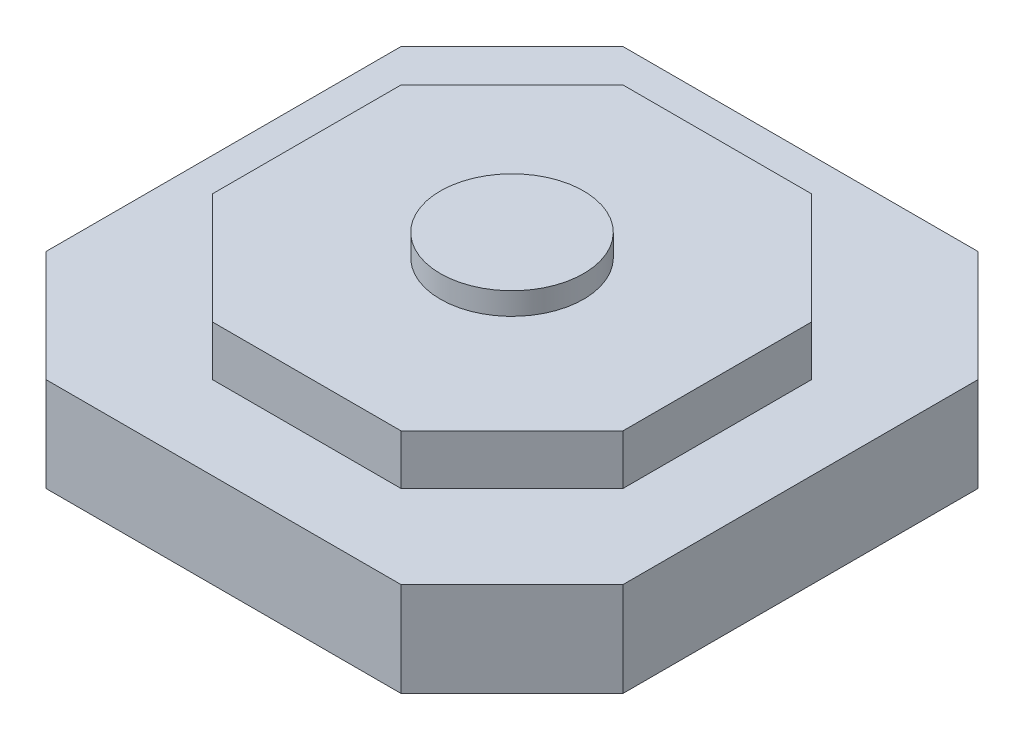
ISO-10303-21;
HEADER;
FILE_DESCRIPTION(('STEP AP214'),'2;1');
FILE_NAME('part.step','',(''),(''),'','','');
FILE_SCHEMA(('AUTOMOTIVE_DESIGN { 1 0 10303 214 1 1 1 1 }'));
ENDSEC;
DATA;
#1=APPLICATION_CONTEXT('core data for automotive mechanical design processes');
#2=APPLICATION_PROTOCOL_DEFINITION('international standard','automotive_design',2000,#1);
#3=PRODUCT_CONTEXT('',#1,'mechanical');
#4=PRODUCT('Part','Part','',(#3));
#5=PRODUCT_RELATED_PRODUCT_CATEGORY('part','',(#4));
#6=PRODUCT_DEFINITION_FORMATION('','',#4);
#7=PRODUCT_DEFINITION_CONTEXT('part definition',#1,'design');
#8=PRODUCT_DEFINITION('design','',#6,#7);
#9=PRODUCT_DEFINITION_SHAPE('','',#8);
#10=(LENGTH_UNIT() NAMED_UNIT(*) SI_UNIT(.MILLI.,.METRE.));
#11=(NAMED_UNIT(*) PLANE_ANGLE_UNIT() SI_UNIT($,.RADIAN.));
#12=(NAMED_UNIT(*) SI_UNIT($,.STERADIAN.) SOLID_ANGLE_UNIT());
#13=UNCERTAINTY_MEASURE_WITH_UNIT(LENGTH_MEASURE(1.E-05),#10,'distance_accuracy_value','');
#14=(GEOMETRIC_REPRESENTATION_CONTEXT(3) GLOBAL_UNCERTAINTY_ASSIGNED_CONTEXT((#13)) GLOBAL_UNIT_ASSIGNED_CONTEXT((#10,
#11,#12)) REPRESENTATION_CONTEXT('',''));
#15=CARTESIAN_POINT('',(0.,0.,0.));
#16=DIRECTION('',(0.,0.,1.));
#17=DIRECTION('',(1.,0.,0.));
#18=AXIS2_PLACEMENT_3D('',#15,#16,#17);
#19=CARTESIAN_POINT('',(2.6,0.85,-2.6));
#20=DIRECTION('',(-1.,0.,0.));
#21=DIRECTION('',(0.,0.,1.));
#22=AXIS2_PLACEMENT_3D('',#19,#20,#21);
#23=PLANE('',#22);
#24=DIRECTION('',(0.,0.,-1.));
#25=VECTOR('',#24,1.);
#26=CARTESIAN_POINT('',(2.6,0.,-2.6));
#27=LINE('',#26,#25);
#28=CARTESIAN_POINT('',(2.6,0.,1.6));
#29=VERTEX_POINT('',#28);
#30=CARTESIAN_POINT('',(2.6,0.,-1.6));
#31=VERTEX_POINT('',#30);
#32=EDGE_CURVE('E185',#29,#31,#27,.T.);
#33=ORIENTED_EDGE('',*,*,#32,.T.);
#34=DIRECTION('',(0.,1.,0.));
#35=VECTOR('',#34,1.);
#36=CARTESIAN_POINT('',(2.6,0.85,-1.6));
#37=LINE('',#36,#35);
#38=CARTESIAN_POINT('',(2.6,0.85,-1.6));
#39=VERTEX_POINT('',#38);
#40=EDGE_CURVE('E209',#31,#39,#37,.T.);
#41=ORIENTED_EDGE('',*,*,#40,.T.);
#42=DIRECTION('',(0.,0.,-1.));
#43=VECTOR('',#42,1.);
#44=CARTESIAN_POINT('',(2.6,0.85,-2.6));
#45=LINE('',#44,#43);
#46=CARTESIAN_POINT('',(2.6,0.85,1.6));
#47=VERTEX_POINT('',#46);
#48=EDGE_CURVE('E183',#47,#39,#45,.T.);
#49=ORIENTED_EDGE('',*,*,#48,.F.);
#50=DIRECTION('',(0.,-1.,0.));
#51=VECTOR('',#50,1.);
#52=CARTESIAN_POINT('',(2.6,0.85,1.6));
#53=LINE('',#52,#51);
#54=EDGE_CURVE('E206',#47,#29,#53,.T.);
#55=ORIENTED_EDGE('',*,*,#54,.T.);
#56=EDGE_LOOP('',(#33,#41,#49,#55));
#57=FACE_BOUND('',#56,.T.);
#58=ADVANCED_FACE('F37',(#57),#23,.F.);
#59=CARTESIAN_POINT('',(-2.6,0.85,-2.6));
#60=DIRECTION('',(0.,0.,1.));
#61=DIRECTION('',(1.,0.,0.));
#62=AXIS2_PLACEMENT_3D('',#59,#60,#61);
#63=PLANE('',#62);
#64=DIRECTION('',(-1.,0.,0.));
#65=VECTOR('',#64,1.);
#66=CARTESIAN_POINT('',(-2.6,0.,-2.6));
#67=LINE('',#66,#65);
#68=CARTESIAN_POINT('',(1.6,0.,-2.6));
#69=VERTEX_POINT('',#68);
#70=CARTESIAN_POINT('',(-1.6,0.,-2.6));
#71=VERTEX_POINT('',#70);
#72=EDGE_CURVE('E180',#69,#71,#67,.T.);
#73=ORIENTED_EDGE('',*,*,#72,.T.);
#74=DIRECTION('',(0.,1.,0.));
#75=VECTOR('',#74,1.);
#76=CARTESIAN_POINT('',(-1.6,0.85,-2.6));
#77=LINE('',#76,#75);
#78=CARTESIAN_POINT('',(-1.6,0.85,-2.6));
#79=VERTEX_POINT('',#78);
#80=EDGE_CURVE('E158',#71,#79,#77,.T.);
#81=ORIENTED_EDGE('',*,*,#80,.T.);
#82=DIRECTION('',(-1.,0.,0.));
#83=VECTOR('',#82,1.);
#84=CARTESIAN_POINT('',(-2.6,0.85,-2.6));
#85=LINE('',#84,#83);
#86=CARTESIAN_POINT('',(1.6,0.85,-2.6));
#87=VERTEX_POINT('',#86);
#88=EDGE_CURVE('E289',#87,#79,#85,.T.);
#89=ORIENTED_EDGE('',*,*,#88,.F.);
#90=DIRECTION('',(0.,-1.,0.));
#91=VECTOR('',#90,1.);
#92=CARTESIAN_POINT('',(1.6,0.85,-2.6));
#93=LINE('',#92,#91);
#94=EDGE_CURVE('E163',#87,#69,#93,.T.);
#95=ORIENTED_EDGE('',*,*,#94,.T.);
#96=EDGE_LOOP('',(#73,#81,#89,#95));
#97=FACE_BOUND('',#96,.T.);
#98=ADVANCED_FACE('F306',(#97),#63,.F.);
#99=CARTESIAN_POINT('',(-2.6,0.85,-2.6));
#100=DIRECTION('',(1.,0.,0.));
#101=DIRECTION('',(0.,0.,-1.));
#102=AXIS2_PLACEMENT_3D('',#99,#100,#101);
#103=PLANE('',#102);
#104=DIRECTION('',(0.,0.,1.));
#105=VECTOR('',#104,1.);
#106=CARTESIAN_POINT('',(-2.6,0.85,-2.6));
#107=LINE('',#106,#105);
#108=CARTESIAN_POINT('',(-2.6,0.85,-1.6));
#109=VERTEX_POINT('',#108);
#110=CARTESIAN_POINT('',(-2.6,0.85,1.6));
#111=VERTEX_POINT('',#110);
#112=EDGE_CURVE('E173',#109,#111,#107,.T.);
#113=ORIENTED_EDGE('',*,*,#112,.F.);
#114=DIRECTION('',(0.,-1.,0.));
#115=VECTOR('',#114,1.);
#116=CARTESIAN_POINT('',(-2.6,0.85,-1.6));
#117=LINE('',#116,#115);
#118=CARTESIAN_POINT('',(-2.6,0.,-1.6));
#119=VERTEX_POINT('',#118);
#120=EDGE_CURVE('E157',#109,#119,#117,.T.);
#121=ORIENTED_EDGE('',*,*,#120,.T.);
#122=DIRECTION('',(0.,0.,1.));
#123=VECTOR('',#122,1.);
#124=CARTESIAN_POINT('',(-2.6,0.,-2.6));
#125=LINE('',#124,#123);
#126=CARTESIAN_POINT('',(-2.6,0.,1.6));
#127=VERTEX_POINT('',#126);
#128=EDGE_CURVE('E170',#119,#127,#125,.T.);
#129=ORIENTED_EDGE('',*,*,#128,.T.);
#130=DIRECTION('',(0.,1.,0.));
#131=VECTOR('',#130,1.);
#132=CARTESIAN_POINT('',(-2.6,0.85,1.6));
#133=LINE('',#132,#131);
#134=EDGE_CURVE('E175',#127,#111,#133,.T.);
#135=ORIENTED_EDGE('',*,*,#134,.T.);
#136=EDGE_LOOP('',(#113,#121,#129,#135));
#137=FACE_BOUND('',#136,.T.);
#138=ADVANCED_FACE('F169',(#137),#103,.F.);
#139=CARTESIAN_POINT('',(-2.6,0.85,2.6));
#140=DIRECTION('',(0.,0.,-1.));
#141=DIRECTION('',(-1.,0.,0.));
#142=AXIS2_PLACEMENT_3D('',#139,#140,#141);
#143=PLANE('',#142);
#144=DIRECTION('',(1.,0.,0.));
#145=VECTOR('',#144,1.);
#146=CARTESIAN_POINT('',(-2.6,0.,2.6));
#147=LINE('',#146,#145);
#148=CARTESIAN_POINT('',(-1.6,0.,2.6));
#149=VERTEX_POINT('',#148);
#150=CARTESIAN_POINT('',(1.6,0.,2.6));
#151=VERTEX_POINT('',#150);
#152=EDGE_CURVE('E179',#149,#151,#147,.T.);
#153=ORIENTED_EDGE('',*,*,#152,.T.);
#154=DIRECTION('',(0.,1.,0.));
#155=VECTOR('',#154,1.);
#156=CARTESIAN_POINT('',(1.6,0.85,2.6));
#157=LINE('',#156,#155);
#158=CARTESIAN_POINT('',(1.6,0.85,2.6));
#159=VERTEX_POINT('',#158);
#160=EDGE_CURVE('E214',#151,#159,#157,.T.);
#161=ORIENTED_EDGE('',*,*,#160,.T.);
#162=DIRECTION('',(1.,0.,0.));
#163=VECTOR('',#162,1.);
#164=CARTESIAN_POINT('',(-2.6,0.85,2.6));
#165=LINE('',#164,#163);
#166=CARTESIAN_POINT('',(-1.6,0.85,2.6));
#167=VERTEX_POINT('',#166);
#168=EDGE_CURVE('E189',#167,#159,#165,.T.);
#169=ORIENTED_EDGE('',*,*,#168,.F.);
#170=DIRECTION('',(0.,-1.,0.));
#171=VECTOR('',#170,1.);
#172=CARTESIAN_POINT('',(-1.6,0.85,2.6));
#173=LINE('',#172,#171);
#174=EDGE_CURVE('E211',#167,#149,#173,.T.);
#175=ORIENTED_EDGE('',*,*,#174,.T.);
#176=EDGE_LOOP('',(#153,#161,#169,#175));
#177=FACE_BOUND('',#176,.T.);
#178=ADVANCED_FACE('F313',(#177),#143,.F.);
#179=CARTESIAN_POINT('',(0.,0.85,0.));
#180=DIRECTION('',(0.,1.,0.));
#181=DIRECTION('',(0.,0.,1.));
#182=AXIS2_PLACEMENT_3D('',#179,#180,#181);
#183=PLANE('',#182);
#184=DIRECTION('',(0.,0.,-1.));
#185=VECTOR('',#184,1.);
#186=CARTESIAN_POINT('',(1.85,0.85,-1.85));
#187=LINE('',#186,#185);
#188=CARTESIAN_POINT('',(1.85,0.85,0.850000000000001));
#189=VERTEX_POINT('',#188);
#190=CARTESIAN_POINT('',(1.85,0.85,-0.849999999999999));
#191=VERTEX_POINT('',#190);
#192=EDGE_CURVE('E250',#189,#191,#187,.T.);
#193=ORIENTED_EDGE('',*,*,#192,.F.);
#194=DIRECTION('',(0.707106781186549,0.,-0.707106781186546));
#195=VECTOR('',#194,1.);
#196=CARTESIAN_POINT('',(1.85,0.85,0.850000000000001));
#197=LINE('',#196,#195);
#198=CARTESIAN_POINT('',(0.849999999999997,0.85,1.85));
#199=VERTEX_POINT('',#198);
#200=EDGE_CURVE('E245',#189,#199,#197,.F.);
#201=ORIENTED_EDGE('',*,*,#200,.T.);
#202=DIRECTION('',(1.,0.,0.));
#203=VECTOR('',#202,1.);
#204=CARTESIAN_POINT('',(-1.85,0.85,1.85));
#205=LINE('',#204,#203);
#206=CARTESIAN_POINT('',(-0.849999999999997,0.85,1.85));
#207=VERTEX_POINT('',#206);
#208=EDGE_CURVE('E276',#207,#199,#205,.T.);
#209=ORIENTED_EDGE('',*,*,#208,.F.);
#210=DIRECTION('',(0.707106781186546,0.,0.707106781186549));
#211=VECTOR('',#210,1.);
#212=CARTESIAN_POINT('',(-0.849999999999997,0.85,1.85));
#213=LINE('',#212,#211);
#214=CARTESIAN_POINT('',(-1.85,0.85,0.849999999999994));
#215=VERTEX_POINT('',#214);
#216=EDGE_CURVE('E243',#207,#215,#213,.F.);
#217=ORIENTED_EDGE('',*,*,#216,.T.);
#218=DIRECTION('',(0.,0.,1.));
#219=VECTOR('',#218,1.);
#220=CARTESIAN_POINT('',(-1.85,0.85,-1.85));
#221=LINE('',#220,#219);
#222=CARTESIAN_POINT('',(-1.85,0.85,-0.850000000000001));
#223=VERTEX_POINT('',#222);
#224=EDGE_CURVE('E282',#223,#215,#221,.T.);
#225=ORIENTED_EDGE('',*,*,#224,.F.);
#226=DIRECTION('',(-0.707106781186549,0.,0.707106781186546));
#227=VECTOR('',#226,1.);
#228=CARTESIAN_POINT('',(-1.85,0.85,-0.850000000000001));
#229=LINE('',#228,#227);
#230=CARTESIAN_POINT('',(-0.849999999999998,0.85,-1.85));
#231=VERTEX_POINT('',#230);
#232=EDGE_CURVE('E42',#223,#231,#229,.F.);
#233=ORIENTED_EDGE('',*,*,#232,.T.);
#234=DIRECTION('',(-1.,0.,0.));
#235=VECTOR('',#234,1.);
#236=CARTESIAN_POINT('',(-1.85,0.85,-1.85));
#237=LINE('',#236,#235);
#238=CARTESIAN_POINT('',(0.850000000000002,0.85,-1.85));
#239=VERTEX_POINT('',#238);
#240=EDGE_CURVE('E251',#239,#231,#237,.T.);
#241=ORIENTED_EDGE('',*,*,#240,.F.);
#242=DIRECTION('',(-0.707106781186546,0.,-0.707106781186549));
#243=VECTOR('',#242,1.);
#244=CARTESIAN_POINT('',(0.850000000000002,0.85,-1.85));
#245=LINE('',#244,#243);
#246=EDGE_CURVE('E61',#239,#191,#245,.F.);
#247=ORIENTED_EDGE('',*,*,#246,.T.);
#248=EDGE_LOOP('',(#193,#201,#209,#217,#225,#233,#241,#247));
#249=FACE_BOUND('',#248,.T.);
#250=ORIENTED_EDGE('',*,*,#88,.T.);
#251=DIRECTION('',(0.707106781186549,0.,-0.707106781186546));
#252=VECTOR('',#251,1.);
#253=CARTESIAN_POINT('',(-2.1,0.85,-2.1));
#254=LINE('',#253,#252);
#255=EDGE_CURVE('E204',#79,#109,#254,.F.);
#256=ORIENTED_EDGE('',*,*,#255,.T.);
#257=ORIENTED_EDGE('',*,*,#112,.T.);
#258=DIRECTION('',(-0.707106781186546,0.,-0.707106781186549));
#259=VECTOR('',#258,1.);
#260=CARTESIAN_POINT('',(-2.1,0.85,2.1));
#261=LINE('',#260,#259);
#262=EDGE_CURVE('E198',#111,#167,#261,.F.);
#263=ORIENTED_EDGE('',*,*,#262,.T.);
#264=ORIENTED_EDGE('',*,*,#168,.T.);
#265=DIRECTION('',(-0.707106781186549,0.,0.707106781186546));
#266=VECTOR('',#265,1.);
#267=CARTESIAN_POINT('',(2.1,0.85,2.1));
#268=LINE('',#267,#266);
#269=EDGE_CURVE('E200',#159,#47,#268,.F.);
#270=ORIENTED_EDGE('',*,*,#269,.T.);
#271=ORIENTED_EDGE('',*,*,#48,.T.);
#272=DIRECTION('',(0.707106781186546,0.,0.707106781186549));
#273=VECTOR('',#272,1.);
#274=CARTESIAN_POINT('',(2.1,0.85,-2.1));
#275=LINE('',#274,#273);
#276=EDGE_CURVE('E202',#39,#87,#275,.F.);
#277=ORIENTED_EDGE('',*,*,#276,.T.);
#278=EDGE_LOOP('',(#250,#256,#257,#263,#264,#270,#271,#277));
#279=FACE_BOUND('',#278,.T.);
#280=ADVANCED_FACE('F248',(#249,#279),#183,.T.);
#281=CARTESIAN_POINT('',(0.,0.,0.));
#282=DIRECTION('',(0.,1.,0.));
#283=DIRECTION('',(0.,0.,1.));
#284=AXIS2_PLACEMENT_3D('',#281,#282,#283);
#285=PLANE('',#284);
#286=ORIENTED_EDGE('',*,*,#128,.F.);
#287=DIRECTION('',(-0.707106781186549,0.,0.707106781186546));
#288=VECTOR('',#287,1.);
#289=CARTESIAN_POINT('',(-2.6,0.,-1.6));
#290=LINE('',#289,#288);
#291=EDGE_CURVE('E153',#119,#71,#290,.F.);
#292=ORIENTED_EDGE('',*,*,#291,.T.);
#293=ORIENTED_EDGE('',*,*,#72,.F.);
#294=DIRECTION('',(-0.707106781186546,0.,-0.707106781186549));
#295=VECTOR('',#294,1.);
#296=CARTESIAN_POINT('',(1.6,0.,-2.6));
#297=LINE('',#296,#295);
#298=EDGE_CURVE('E164',#69,#31,#297,.F.);
#299=ORIENTED_EDGE('',*,*,#298,.T.);
#300=ORIENTED_EDGE('',*,*,#32,.F.);
#301=DIRECTION('',(0.707106781186549,0.,-0.707106781186546));
#302=VECTOR('',#301,1.);
#303=CARTESIAN_POINT('',(2.6,0.,1.6));
#304=LINE('',#303,#302);
#305=EDGE_CURVE('E192',#29,#151,#304,.F.);
#306=ORIENTED_EDGE('',*,*,#305,.T.);
#307=ORIENTED_EDGE('',*,*,#152,.F.);
#308=DIRECTION('',(0.707106781186546,0.,0.707106781186549));
#309=VECTOR('',#308,1.);
#310=CARTESIAN_POINT('',(-1.6,0.,2.6));
#311=LINE('',#310,#309);
#312=EDGE_CURVE('E174',#149,#127,#311,.F.);
#313=ORIENTED_EDGE('',*,*,#312,.T.);
#314=EDGE_LOOP('',(#286,#292,#293,#299,#300,#306,#307,#313));
#315=FACE_BOUND('',#314,.T.);
#316=ADVANCED_FACE('F177',(#315),#285,.F.);
#317=CARTESIAN_POINT('',(-2.6,0.85,-1.6));
#318=DIRECTION('',(0.707106781186546,0.,0.707106781186549));
#319=DIRECTION('',(0.,-1.,0.));
#320=AXIS2_PLACEMENT_3D('',#317,#318,#319);
#321=PLANE('',#320);
#322=ORIENTED_EDGE('',*,*,#255,.F.);
#323=ORIENTED_EDGE('',*,*,#80,.F.);
#324=ORIENTED_EDGE('',*,*,#291,.F.);
#325=ORIENTED_EDGE('',*,*,#120,.F.);
#326=EDGE_LOOP('',(#322,#323,#324,#325));
#327=FACE_BOUND('',#326,.T.);
#328=ADVANCED_FACE('F156',(#327),#321,.F.);
#329=CARTESIAN_POINT('',(1.6,0.85,-2.6));
#330=DIRECTION('',(-0.707106781186549,0.,0.707106781186546));
#331=DIRECTION('',(0.,-1.,0.));
#332=AXIS2_PLACEMENT_3D('',#329,#330,#331);
#333=PLANE('',#332);
#334=ORIENTED_EDGE('',*,*,#276,.F.);
#335=ORIENTED_EDGE('',*,*,#40,.F.);
#336=ORIENTED_EDGE('',*,*,#298,.F.);
#337=ORIENTED_EDGE('',*,*,#94,.F.);
#338=EDGE_LOOP('',(#334,#335,#336,#337));
#339=FACE_BOUND('',#338,.T.);
#340=ADVANCED_FACE('F302',(#339),#333,.F.);
#341=CARTESIAN_POINT('',(2.6,0.85,1.6));
#342=DIRECTION('',(-0.707106781186546,0.,-0.707106781186549));
#343=DIRECTION('',(0.,-1.,0.));
#344=AXIS2_PLACEMENT_3D('',#341,#342,#343);
#345=PLANE('',#344);
#346=ORIENTED_EDGE('',*,*,#269,.F.);
#347=ORIENTED_EDGE('',*,*,#160,.F.);
#348=ORIENTED_EDGE('',*,*,#305,.F.);
#349=ORIENTED_EDGE('',*,*,#54,.F.);
#350=EDGE_LOOP('',(#346,#347,#348,#349));
#351=FACE_BOUND('',#350,.T.);
#352=ADVANCED_FACE('F329',(#351),#345,.F.);
#353=CARTESIAN_POINT('',(-1.6,0.85,2.6));
#354=DIRECTION('',(0.707106781186549,0.,-0.707106781186546));
#355=DIRECTION('',(0.,-1.,0.));
#356=AXIS2_PLACEMENT_3D('',#353,#354,#355);
#357=PLANE('',#356);
#358=ORIENTED_EDGE('',*,*,#262,.F.);
#359=ORIENTED_EDGE('',*,*,#134,.F.);
#360=ORIENTED_EDGE('',*,*,#312,.F.);
#361=ORIENTED_EDGE('',*,*,#174,.F.);
#362=EDGE_LOOP('',(#358,#359,#360,#361));
#363=FACE_BOUND('',#362,.T.);
#364=ADVANCED_FACE('F335',(#363),#357,.F.);
#365=CARTESIAN_POINT('',(1.85,1.3,-1.85));
#366=DIRECTION('',(-1.,0.,0.));
#367=DIRECTION('',(0.,0.,1.));
#368=AXIS2_PLACEMENT_3D('',#365,#366,#367);
#369=PLANE('',#368);
#370=DIRECTION('',(0.,0.,-1.));
#371=VECTOR('',#370,1.);
#372=CARTESIAN_POINT('',(1.85,1.3,-1.85));
#373=LINE('',#372,#371);
#374=CARTESIAN_POINT('',(1.85,1.3,0.850000000000001));
#375=VERTEX_POINT('',#374);
#376=CARTESIAN_POINT('',(1.85,1.3,-0.849999999999999));
#377=VERTEX_POINT('',#376);
#378=EDGE_CURVE('E268',#375,#377,#373,.T.);
#379=ORIENTED_EDGE('',*,*,#378,.F.);
#380=DIRECTION('',(0.,-1.,0.));
#381=VECTOR('',#380,1.);
#382=CARTESIAN_POINT('',(1.85,1.3,0.850000000000001));
#383=LINE('',#382,#381);
#384=EDGE_CURVE('E236',#375,#189,#383,.T.);
#385=ORIENTED_EDGE('',*,*,#384,.T.);
#386=ORIENTED_EDGE('',*,*,#192,.T.);
#387=DIRECTION('',(0.,1.,0.));
#388=VECTOR('',#387,1.);
#389=CARTESIAN_POINT('',(1.85,1.3,-0.849999999999999));
#390=LINE('',#389,#388);
#391=EDGE_CURVE('E234',#191,#377,#390,.T.);
#392=ORIENTED_EDGE('',*,*,#391,.T.);
#393=EDGE_LOOP('',(#379,#385,#386,#392));
#394=FACE_BOUND('',#393,.T.);
#395=ADVANCED_FACE('F254',(#394),#369,.F.);
#396=CARTESIAN_POINT('',(-1.85,1.3,-1.85));
#397=DIRECTION('',(0.,0.,1.));
#398=DIRECTION('',(1.,0.,0.));
#399=AXIS2_PLACEMENT_3D('',#396,#397,#398);
#400=PLANE('',#399);
#401=DIRECTION('',(-1.,0.,0.));
#402=VECTOR('',#401,1.);
#403=CARTESIAN_POINT('',(-1.85,1.3,-1.85));
#404=LINE('',#403,#402);
#405=CARTESIAN_POINT('',(0.850000000000002,1.3,-1.85));
#406=VERTEX_POINT('',#405);
#407=CARTESIAN_POINT('',(-0.849999999999998,1.3,-1.85));
#408=VERTEX_POINT('',#407);
#409=EDGE_CURVE('E266',#406,#408,#404,.T.);
#410=ORIENTED_EDGE('',*,*,#409,.F.);
#411=DIRECTION('',(0.,-1.,0.));
#412=VECTOR('',#411,1.);
#413=CARTESIAN_POINT('',(0.850000000000002,1.3,-1.85));
#414=LINE('',#413,#412);
#415=EDGE_CURVE('E241',#406,#239,#414,.T.);
#416=ORIENTED_EDGE('',*,*,#415,.T.);
#417=ORIENTED_EDGE('',*,*,#240,.T.);
#418=DIRECTION('',(0.,1.,0.));
#419=VECTOR('',#418,1.);
#420=CARTESIAN_POINT('',(-0.849999999999998,1.3,-1.85));
#421=LINE('',#420,#419);
#422=EDGE_CURVE('E239',#231,#408,#421,.T.);
#423=ORIENTED_EDGE('',*,*,#422,.T.);
#424=EDGE_LOOP('',(#410,#416,#417,#423));
#425=FACE_BOUND('',#424,.T.);
#426=ADVANCED_FACE('F270',(#425),#400,.F.);
#427=CARTESIAN_POINT('',(-1.85,1.3,-1.85));
#428=DIRECTION('',(1.,0.,0.));
#429=DIRECTION('',(0.,0.,-1.));
#430=AXIS2_PLACEMENT_3D('',#427,#428,#429);
#431=PLANE('',#430);
#432=ORIENTED_EDGE('',*,*,#224,.T.);
#433=DIRECTION('',(0.,1.,0.));
#434=VECTOR('',#433,1.);
#435=CARTESIAN_POINT('',(-1.85,1.3,0.849999999999994));
#436=LINE('',#435,#434);
#437=CARTESIAN_POINT('',(-1.85,1.3,0.849999999999994));
#438=VERTEX_POINT('',#437);
#439=EDGE_CURVE('E224',#215,#438,#436,.T.);
#440=ORIENTED_EDGE('',*,*,#439,.T.);
#441=DIRECTION('',(0.,0.,1.));
#442=VECTOR('',#441,1.);
#443=CARTESIAN_POINT('',(-1.85,1.3,-1.85));
#444=LINE('',#443,#442);
#445=CARTESIAN_POINT('',(-1.85,1.3,-0.850000000000001));
#446=VERTEX_POINT('',#445);
#447=EDGE_CURVE('E272',#446,#438,#444,.T.);
#448=ORIENTED_EDGE('',*,*,#447,.F.);
#449=DIRECTION('',(0.,-1.,0.));
#450=VECTOR('',#449,1.);
#451=CARTESIAN_POINT('',(-1.85,1.3,-0.850000000000001));
#452=LINE('',#451,#450);
#453=EDGE_CURVE('E221',#446,#223,#452,.T.);
#454=ORIENTED_EDGE('',*,*,#453,.T.);
#455=EDGE_LOOP('',(#432,#440,#448,#454));
#456=FACE_BOUND('',#455,.T.);
#457=ADVANCED_FACE('F374',(#456),#431,.F.);
#458=CARTESIAN_POINT('',(-1.85,1.3,1.85));
#459=DIRECTION('',(0.,0.,-1.));
#460=DIRECTION('',(-1.,0.,0.));
#461=AXIS2_PLACEMENT_3D('',#458,#459,#460);
#462=PLANE('',#461);
#463=DIRECTION('',(1.,0.,0.));
#464=VECTOR('',#463,1.);
#465=CARTESIAN_POINT('',(-1.85,1.3,1.85));
#466=LINE('',#465,#464);
#467=CARTESIAN_POINT('',(-0.849999999999997,1.3,1.85));
#468=VERTEX_POINT('',#467);
#469=CARTESIAN_POINT('',(0.849999999999997,1.3,1.85));
#470=VERTEX_POINT('',#469);
#471=EDGE_CURVE('E274',#468,#470,#466,.T.);
#472=ORIENTED_EDGE('',*,*,#471,.F.);
#473=DIRECTION('',(0.,-1.,0.));
#474=VECTOR('',#473,1.);
#475=CARTESIAN_POINT('',(-0.849999999999997,1.3,1.85));
#476=LINE('',#475,#474);
#477=EDGE_CURVE('E218',#468,#207,#476,.T.);
#478=ORIENTED_EDGE('',*,*,#477,.T.);
#479=ORIENTED_EDGE('',*,*,#208,.T.);
#480=DIRECTION('',(0.,1.,0.));
#481=VECTOR('',#480,1.);
#482=CARTESIAN_POINT('',(0.849999999999997,1.3,1.85));
#483=LINE('',#482,#481);
#484=EDGE_CURVE('E216',#199,#470,#483,.T.);
#485=ORIENTED_EDGE('',*,*,#484,.T.);
#486=EDGE_LOOP('',(#472,#478,#479,#485));
#487=FACE_BOUND('',#486,.T.);
#488=ADVANCED_FACE('F380',(#487),#462,.F.);
#489=CARTESIAN_POINT('',(0.,1.3,0.));
#490=DIRECTION('',(0.,1.,0.));
#491=DIRECTION('',(0.,0.,1.));
#492=AXIS2_PLACEMENT_3D('',#489,#490,#491);
#493=PLANE('',#492);
#494=CARTESIAN_POINT('',(0.,1.3,0.));
#495=DIRECTION('',(0.,1.,0.));
#496=DIRECTION('',(0.,0.,1.));
#497=AXIS2_PLACEMENT_3D('',#494,#495,#496);
#498=CIRCLE('',#497,0.645603451058506);
#499=CARTESIAN_POINT('',(0.,1.3,0.645603451058506));
#500=VERTEX_POINT('',#499);
#501=EDGE_CURVE('E11',#500,#500,#498,.T.);
#502=ORIENTED_EDGE('',*,*,#501,.F.);
#503=EDGE_LOOP('',(#502));
#504=FACE_BOUND('',#503,.T.);
#505=ORIENTED_EDGE('',*,*,#447,.T.);
#506=DIRECTION('',(-0.707106781186546,0.,-0.707106781186549));
#507=VECTOR('',#506,1.);
#508=CARTESIAN_POINT('',(-1.35,1.3,1.35));
#509=LINE('',#508,#507);
#510=EDGE_CURVE('E232',#438,#468,#509,.F.);
#511=ORIENTED_EDGE('',*,*,#510,.T.);
#512=ORIENTED_EDGE('',*,*,#471,.T.);
#513=DIRECTION('',(-0.707106781186549,0.,0.707106781186546));
#514=VECTOR('',#513,1.);
#515=CARTESIAN_POINT('',(1.35,1.3,1.35));
#516=LINE('',#515,#514);
#517=EDGE_CURVE('E230',#470,#375,#516,.F.);
#518=ORIENTED_EDGE('',*,*,#517,.T.);
#519=ORIENTED_EDGE('',*,*,#378,.T.);
#520=DIRECTION('',(0.707106781186546,0.,0.707106781186549));
#521=VECTOR('',#520,1.);
#522=CARTESIAN_POINT('',(1.35,1.3,-1.35));
#523=LINE('',#522,#521);
#524=EDGE_CURVE('E228',#377,#406,#523,.F.);
#525=ORIENTED_EDGE('',*,*,#524,.T.);
#526=ORIENTED_EDGE('',*,*,#409,.T.);
#527=DIRECTION('',(0.707106781186549,0.,-0.707106781186546));
#528=VECTOR('',#527,1.);
#529=CARTESIAN_POINT('',(-1.35,1.3,-1.35));
#530=LINE('',#529,#528);
#531=EDGE_CURVE('E226',#408,#446,#530,.F.);
#532=ORIENTED_EDGE('',*,*,#531,.T.);
#533=EDGE_LOOP('',(#505,#511,#512,#518,#519,#525,#526,#532));
#534=FACE_BOUND('',#533,.T.);
#535=ADVANCED_FACE('F265',(#504,#534),#493,.T.);
#536=CARTESIAN_POINT('',(-0.849999999999997,1.3,1.85));
#537=DIRECTION('',(0.707106781186549,0.,-0.707106781186546));
#538=DIRECTION('',(0.,-1.,0.));
#539=AXIS2_PLACEMENT_3D('',#536,#537,#538);
#540=PLANE('',#539);
#541=ORIENTED_EDGE('',*,*,#510,.F.);
#542=ORIENTED_EDGE('',*,*,#439,.F.);
#543=ORIENTED_EDGE('',*,*,#216,.F.);
#544=ORIENTED_EDGE('',*,*,#477,.F.);
#545=EDGE_LOOP('',(#541,#542,#543,#544));
#546=FACE_BOUND('',#545,.T.);
#547=ADVANCED_FACE('F343',(#546),#540,.F.);
#548=CARTESIAN_POINT('',(1.85,1.3,0.850000000000001));
#549=DIRECTION('',(-0.707106781186546,0.,-0.707106781186549));
#550=DIRECTION('',(0.,-1.,0.));
#551=AXIS2_PLACEMENT_3D('',#548,#549,#550);
#552=PLANE('',#551);
#553=ORIENTED_EDGE('',*,*,#517,.F.);
#554=ORIENTED_EDGE('',*,*,#484,.F.);
#555=ORIENTED_EDGE('',*,*,#200,.F.);
#556=ORIENTED_EDGE('',*,*,#384,.F.);
#557=EDGE_LOOP('',(#553,#554,#555,#556));
#558=FACE_BOUND('',#557,.T.);
#559=ADVANCED_FACE('F349',(#558),#552,.F.);
#560=CARTESIAN_POINT('',(0.850000000000002,1.3,-1.85));
#561=DIRECTION('',(-0.707106781186549,0.,0.707106781186546));
#562=DIRECTION('',(0.,-1.,0.));
#563=AXIS2_PLACEMENT_3D('',#560,#561,#562);
#564=PLANE('',#563);
#565=ORIENTED_EDGE('',*,*,#524,.F.);
#566=ORIENTED_EDGE('',*,*,#391,.F.);
#567=ORIENTED_EDGE('',*,*,#246,.F.);
#568=ORIENTED_EDGE('',*,*,#415,.F.);
#569=EDGE_LOOP('',(#565,#566,#567,#568));
#570=FACE_BOUND('',#569,.T.);
#571=ADVANCED_FACE('F260',(#570),#564,.F.);
#572=CARTESIAN_POINT('',(-1.85,1.3,-0.850000000000001));
#573=DIRECTION('',(0.707106781186546,0.,0.707106781186549));
#574=DIRECTION('',(0.,-1.,0.));
#575=AXIS2_PLACEMENT_3D('',#572,#573,#574);
#576=PLANE('',#575);
#577=ORIENTED_EDGE('',*,*,#531,.F.);
#578=ORIENTED_EDGE('',*,*,#422,.F.);
#579=ORIENTED_EDGE('',*,*,#232,.F.);
#580=ORIENTED_EDGE('',*,*,#453,.F.);
#581=EDGE_LOOP('',(#577,#578,#579,#580));
#582=FACE_BOUND('',#581,.T.);
#583=ADVANCED_FACE('F40',(#582),#576,.F.);
#584=CARTESIAN_POINT('',(0.,1.5,0.));
#585=DIRECTION('',(0.,-1.,0.));
#586=DIRECTION('',(0.,0.,-1.));
#587=AXIS2_PLACEMENT_3D('',#584,#585,#586);
#588=CYLINDRICAL_SURFACE('',#587,0.645603451058506);
#589=CARTESIAN_POINT('',(0.,1.5,0.));
#590=DIRECTION('',(0.,1.,0.));
#591=DIRECTION('',(0.,0.,1.));
#592=AXIS2_PLACEMENT_3D('',#589,#590,#591);
#593=CIRCLE('',#592,0.645603451058506);
#594=CARTESIAN_POINT('',(0.,1.5,0.645603451058506));
#595=VERTEX_POINT('',#594);
#596=EDGE_CURVE('E257',#595,#595,#593,.T.);
#597=ORIENTED_EDGE('',*,*,#596,.F.);
#598=EDGE_LOOP('',(#597));
#599=FACE_BOUND('',#598,.T.);
#600=ORIENTED_EDGE('',*,*,#501,.T.);
#601=EDGE_LOOP('',(#600));
#602=FACE_BOUND('',#601,.T.);
#603=ADVANCED_FACE('F362',(#599,#602),#588,.T.);
#604=CARTESIAN_POINT('',(0.,1.5,0.));
#605=DIRECTION('',(0.,1.,0.));
#606=DIRECTION('',(0.,0.,1.));
#607=AXIS2_PLACEMENT_3D('',#604,#605,#606);
#608=PLANE('',#607);
#609=ORIENTED_EDGE('',*,*,#596,.T.);
#610=EDGE_LOOP('',(#609));
#611=FACE_BOUND('',#610,.T.);
#612=ADVANCED_FACE('F367',(#611),#608,.T.);
#613=CLOSED_SHELL('',(#58,#98,#138,#178,#280,#316,#328,#340,#352,#364,#395,#426,#457,#488,#535,
#547,#559,#571,#583,#603,#612));
#614=MANIFOLD_SOLID_BREP('B2',#613);
#615=ADVANCED_BREP_SHAPE_REPRESENTATION('',(#18,#614),#14);
#616=SHAPE_DEFINITION_REPRESENTATION(#9,#615);
ENDSEC;
END-ISO-10303-21;
